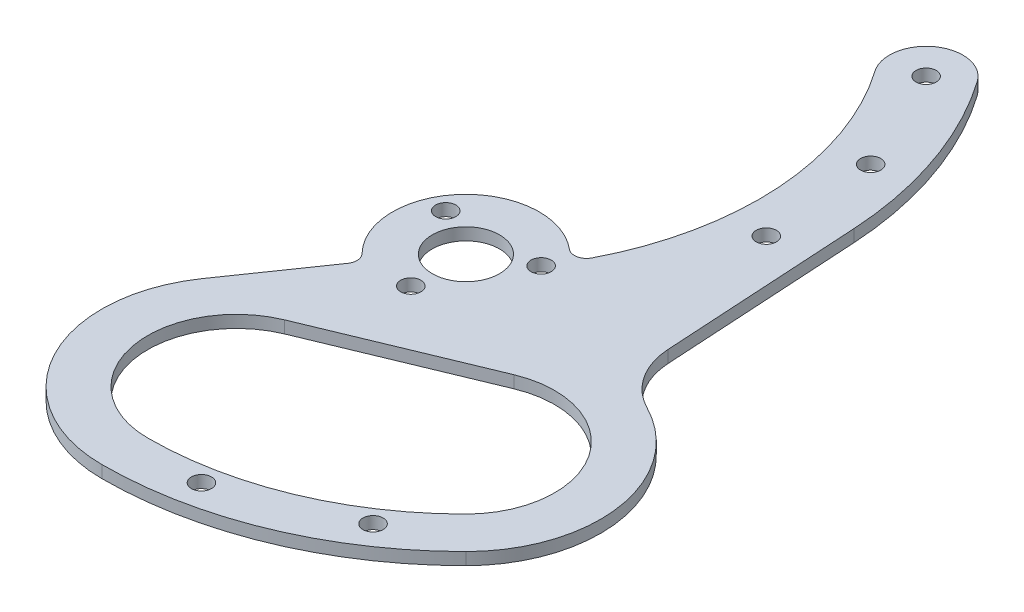
ISO-10303-21;
HEADER;
FILE_DESCRIPTION(('STEP AP214'),'2;1');
FILE_NAME('part.step','',(''),(''),'','','');
FILE_SCHEMA(('AUTOMOTIVE_DESIGN { 1 0 10303 214 1 1 1 1 }'));
ENDSEC;
DATA;
#1=APPLICATION_CONTEXT('core data for automotive mechanical design processes');
#2=APPLICATION_PROTOCOL_DEFINITION('international standard','automotive_design',2000,#1);
#3=PRODUCT_CONTEXT('',#1,'mechanical');
#4=PRODUCT('Part','Part','',(#3));
#5=PRODUCT_RELATED_PRODUCT_CATEGORY('part','',(#4));
#6=PRODUCT_DEFINITION_FORMATION('','',#4);
#7=PRODUCT_DEFINITION_CONTEXT('part definition',#1,'design');
#8=PRODUCT_DEFINITION('design','',#6,#7);
#9=PRODUCT_DEFINITION_SHAPE('','',#8);
#10=(LENGTH_UNIT() NAMED_UNIT(*) SI_UNIT(.MILLI.,.METRE.));
#11=(NAMED_UNIT(*) PLANE_ANGLE_UNIT() SI_UNIT($,.RADIAN.));
#12=(NAMED_UNIT(*) SI_UNIT($,.STERADIAN.) SOLID_ANGLE_UNIT());
#13=UNCERTAINTY_MEASURE_WITH_UNIT(LENGTH_MEASURE(1.E-05),#10,'distance_accuracy_value','');
#14=(GEOMETRIC_REPRESENTATION_CONTEXT(3) GLOBAL_UNCERTAINTY_ASSIGNED_CONTEXT((#13)) GLOBAL_UNIT_ASSIGNED_CONTEXT((#10,
#11,#12)) REPRESENTATION_CONTEXT('',''));
#15=CARTESIAN_POINT('',(0.,0.,0.));
#16=DIRECTION('',(0.,0.,1.));
#17=DIRECTION('',(1.,0.,0.));
#18=AXIS2_PLACEMENT_3D('',#15,#16,#17);
#19=CARTESIAN_POINT('',(12.4144052382109,2.,-62.7929327163513));
#20=DIRECTION('',(0.,-1.,0.));
#21=DIRECTION('',(0.,0.,-1.));
#22=AXIS2_PLACEMENT_3D('',#19,#20,#21);
#23=PLANE('',#22);
#24=CARTESIAN_POINT('',(12.4144052382108,2.,-62.7929327163513));
#25=DIRECTION('',(0.,-1.,0.));
#26=DIRECTION('',(0.,0.,-1.));
#27=AXIS2_PLACEMENT_3D('',#24,#25,#26);
#28=CIRCLE('',#27,1.65000000000008);
#29=CARTESIAN_POINT('',(12.4144052382108,2.,-64.4429327163514));
#30=VERTEX_POINT('',#29);
#31=EDGE_CURVE('E481',#30,#30,#28,.T.);
#32=ORIENTED_EDGE('',*,*,#31,.T.);
#33=EDGE_LOOP('',(#32));
#34=FACE_BOUND('',#33,.T.);
#35=CARTESIAN_POINT('',(20.340189466215,2.,-45.7960335889309));
#36=DIRECTION('',(0.,-1.,0.));
#37=DIRECTION('',(0.,0.,-1.));
#38=AXIS2_PLACEMENT_3D('',#35,#36,#37);
#39=CIRCLE('',#38,1.64999999999996);
#40=CARTESIAN_POINT('',(20.340189466215,2.,-47.4460335889308));
#41=VERTEX_POINT('',#40);
#42=EDGE_CURVE('E486',#41,#41,#39,.T.);
#43=ORIENTED_EDGE('',*,*,#42,.T.);
#44=EDGE_LOOP('',(#43));
#45=FACE_BOUND('',#44,.T.);
#46=CARTESIAN_POINT('',(21.9747085435597,2.,-27.1133950450212));
#47=DIRECTION('',(0.,-1.,0.));
#48=DIRECTION('',(0.,0.,-1.));
#49=AXIS2_PLACEMENT_3D('',#46,#47,#48);
#50=CIRCLE('',#49,1.65);
#51=CARTESIAN_POINT('',(21.9747085435597,2.,-28.7633950450212));
#52=VERTEX_POINT('',#51);
#53=EDGE_CURVE('E441',#52,#52,#50,.T.);
#54=ORIENTED_EDGE('',*,*,#53,.T.);
#55=EDGE_LOOP('',(#54));
#56=FACE_BOUND('',#55,.T.);
#57=CARTESIAN_POINT('',(30.5548779494707,2.,45.7286064167185));
#58=DIRECTION('',(0.,1.,0.));
#59=DIRECTION('',(0.,0.,-1.));
#60=AXIS2_PLACEMENT_3D('',#57,#58,#59);
#61=CIRCLE('',#60,1.65);
#62=CARTESIAN_POINT('',(30.5548779494707,2.,44.0786064167185));
#63=VERTEX_POINT('',#62);
#64=EDGE_CURVE('E192',#63,#63,#61,.T.);
#65=ORIENTED_EDGE('',*,*,#64,.F.);
#66=EDGE_LOOP('',(#65));
#67=FACE_BOUND('',#66,.T.);
#68=CARTESIAN_POINT('',(10.7294462950743,2.,53.9405690878703));
#69=DIRECTION('',(0.,1.,0.));
#70=DIRECTION('',(0.,0.,1.));
#71=AXIS2_PLACEMENT_3D('',#68,#69,#70);
#72=CIRCLE('',#71,1.65);
#73=CARTESIAN_POINT('',(10.7294462950743,2.,55.5905690878703));
#74=VERTEX_POINT('',#73);
#75=EDGE_CURVE('E198',#74,#74,#72,.T.);
#76=ORIENTED_EDGE('',*,*,#75,.F.);
#77=EDGE_LOOP('',(#76));
#78=FACE_BOUND('',#77,.T.);
#79=CARTESIAN_POINT('',(12.4144052382109,2.,-62.7929327163513));
#80=DIRECTION('',(0.,1.,0.));
#81=DIRECTION('',(0.,0.,-1.));
#82=AXIS2_PLACEMENT_3D('',#79,#80,#81);
#83=CIRCLE('',#82,6.);
#84=CARTESIAN_POINT('',(17.3293175039448,2.,-66.2343913344576));
#85=VERTEX_POINT('',#84);
#86=CARTESIAN_POINT('',(7.49949297247695,2.,-59.351474098245));
#87=VERTEX_POINT('',#86);
#88=EDGE_CURVE('E204',#85,#87,#83,.T.);
#89=ORIENTED_EDGE('',*,*,#88,.T.);
#90=CARTESIAN_POINT('',(-31.8198051533946,2.,-31.8198051533947));
#91=DIRECTION('',(0.,-1.,0.));
#92=DIRECTION('',(0.,0.,-1.));
#93=AXIS2_PLACEMENT_3D('',#90,#91,#92);
#94=CIRCLE('',#93,48.);
#95=CARTESIAN_POINT('',(10.8166216797478,2.,-9.77133339451546));
#96=VERTEX_POINT('',#95);
#97=EDGE_CURVE('E207',#87,#96,#94,.T.);
#98=ORIENTED_EDGE('',*,*,#97,.T.);
#99=CARTESIAN_POINT('',(9.04010389503357,2.,-10.6900197178021));
#100=DIRECTION('',(0.,-1.,0.));
#101=DIRECTION('',(0.,0.,-1.));
#102=AXIS2_PLACEMENT_3D('',#99,#100,#101);
#103=CIRCLE('',#102,2.);
#104=CARTESIAN_POINT('',(7.74866048145734,2.,-9.16287404383036));
#105=VERTEX_POINT('',#104);
#106=EDGE_CURVE('E279',#96,#105,#103,.T.);
#107=ORIENTED_EDGE('',*,*,#106,.T.);
#108=CARTESIAN_POINT('',(0.,2.,0.));
#109=DIRECTION('',(0.,1.,0.));
#110=DIRECTION('',(0.,0.,1.));
#111=AXIS2_PLACEMENT_3D('',#108,#109,#110);
#112=CIRCLE('',#111,12.);
#113=CARTESIAN_POINT('',(-8.57705807279926,2.,8.39250110609631));
#114=VERTEX_POINT('',#113);
#115=EDGE_CURVE('E211',#105,#114,#112,.T.);
#116=ORIENTED_EDGE('',*,*,#115,.T.);
#117=CARTESIAN_POINT('',(-10.0065677515991,2.,9.7912512904457));
#118=DIRECTION('',(0.,-1.,0.));
#119=DIRECTION('',(0.,0.,-1.));
#120=AXIS2_PLACEMENT_3D('',#117,#118,#119);
#121=CIRCLE('',#120,2.);
#122=CARTESIAN_POINT('',(-8.36222213886381,2.,10.9297272479775));
#123=VERTEX_POINT('',#122);
#124=EDGE_CURVE('E275',#114,#123,#121,.T.);
#125=ORIENTED_EDGE('',*,*,#124,.T.);
#126=DIRECTION('',(-0.569237978765922,0.,0.822172806367669));
#127=VECTOR('',#126,1.);
#128=CARTESIAN_POINT('',(-7.35806894846151,2.,9.47938929202116));
#129=LINE('',#128,#127);
#130=CARTESIAN_POINT('',(-18.0878017400887,2.,24.9767644671498));
#131=VERTEX_POINT('',#130);
#132=EDGE_CURVE('E214',#123,#131,#129,.T.);
#133=ORIENTED_EDGE('',*,*,#132,.T.);
#134=CARTESIAN_POINT('',(0.,2.,37.5));
#135=DIRECTION('',(0.,1.,0.));
#136=DIRECTION('',(0.,0.,-1.));
#137=AXIS2_PLACEMENT_3D('',#134,#135,#136);
#138=CIRCLE('',#137,22.);
#139=CARTESIAN_POINT('',(0.,2.,59.5));
#140=VERTEX_POINT('',#139);
#141=EDGE_CURVE('E216',#131,#140,#138,.T.);
#142=ORIENTED_EDGE('',*,*,#141,.T.);
#143=CARTESIAN_POINT('',(0.,2.,0.));
#144=DIRECTION('',(0.,1.,0.));
#145=DIRECTION('',(0.,0.,-1.));
#146=AXIS2_PLACEMENT_3D('',#143,#144,#145);
#147=CIRCLE('',#146,59.5);
#148=CARTESIAN_POINT('',(42.0728534805996,2.,42.0728534805995));
#149=VERTEX_POINT('',#148);
#150=EDGE_CURVE('E218',#140,#149,#147,.T.);
#151=ORIENTED_EDGE('',*,*,#150,.T.);
#152=CARTESIAN_POINT('',(26.5165042944956,2.,26.5165042944955));
#153=DIRECTION('',(0.,1.,0.));
#154=DIRECTION('',(0.,0.,1.));
#155=AXIS2_PLACEMENT_3D('',#152,#153,#154);
#156=CIRCLE('',#155,22.);
#157=CARTESIAN_POINT('',(36.5104743417037,2.,6.91751037400286));
#158=VERTEX_POINT('',#157);
#159=EDGE_CURVE('E220',#149,#158,#156,.T.);
#160=ORIENTED_EDGE('',*,*,#159,.T.);
#161=CARTESIAN_POINT('',(41.9617307310899,2.,-3.77284994626585));
#162=DIRECTION('',(0.,-1.,0.));
#163=DIRECTION('',(0.,0.,-1.));
#164=AXIS2_PLACEMENT_3D('',#161,#162,#163);
#165=CIRCLE('',#164,12.);
#166=CARTESIAN_POINT('',(29.9825963673094,2.,-3.0655028642094));
#167=VERTEX_POINT('',#166);
#168=EDGE_CURVE('E11',#158,#167,#165,.T.);
#169=ORIENTED_EDGE('',*,*,#168,.T.);
#170=DIRECTION('',(-0.0589455901713703,0.,-0.998261196981706));
#171=VECTOR('',#170,1.);
#172=CARTESIAN_POINT('',(30.4512467939954,2.,4.87123225964618));
#173=LINE('',#172,#171);
#174=CARTESIAN_POINT('',(28.0758666655078,2.,-35.3565405636769));
#175=VERTEX_POINT('',#174);
#176=EDGE_CURVE('E222',#167,#175,#173,.T.);
#177=ORIENTED_EDGE('',*,*,#176,.T.);
#178=CARTESIAN_POINT('',(-31.8198051533946,2.,-31.8198051533947));
#179=DIRECTION('',(0.,1.,0.));
#180=DIRECTION('',(0.,0.,-1.));
#181=AXIS2_PLACEMENT_3D('',#178,#179,#180);
#182=CIRCLE('',#181,60.);
#183=EDGE_CURVE('E224',#175,#85,#182,.T.);
#184=ORIENTED_EDGE('',*,*,#183,.T.);
#185=EDGE_LOOP('',(#89,#98,#107,#116,#125,#133,#142,#151,#160,#169,#177,#184));
#186=FACE_BOUND('',#185,.T.);
#187=CARTESIAN_POINT('',(0.,2.,37.5));
#188=DIRECTION('',(0.,1.,0.));
#189=DIRECTION('',(0.,0.,-1.));
#190=AXIS2_PLACEMENT_3D('',#187,#188,#189);
#191=CIRCLE('',#190,14.5);
#192=CARTESIAN_POINT('',(-5.54890976929381,2.,24.1037467785863));
#193=VERTEX_POINT('',#192);
#194=CARTESIAN_POINT('',(0.,2.,52.));
#195=VERTEX_POINT('',#194);
#196=EDGE_CURVE('E148',#193,#195,#191,.T.);
#197=ORIENTED_EDGE('',*,*,#196,.F.);
#198=DIRECTION('',(-0.923879532511287,0.,0.38268343236509));
#199=VECTOR('',#198,1.);
#200=CARTESIAN_POINT('',(-5.54890976929381,2.,24.1037467785863));
#201=LINE('',#200,#199);
#202=CARTESIAN_POINT('',(20.9675945252018,2.,13.1202510730819));
#203=VERTEX_POINT('',#202);
#204=EDGE_CURVE('E174',#203,#193,#201,.T.);
#205=ORIENTED_EDGE('',*,*,#204,.F.);
#206=CARTESIAN_POINT('',(26.5165042944956,2.,26.5165042944955));
#207=DIRECTION('',(0.,1.,0.));
#208=DIRECTION('',(0.,0.,1.));
#209=AXIS2_PLACEMENT_3D('',#206,#207,#208);
#210=CIRCLE('',#209,14.5);
#211=CARTESIAN_POINT('',(36.7695526217005,2.,36.7695526217004));
#212=VERTEX_POINT('',#211);
#213=EDGE_CURVE('E172',#212,#203,#210,.T.);
#214=ORIENTED_EDGE('',*,*,#213,.F.);
#215=CARTESIAN_POINT('',(0.,2.,0.));
#216=DIRECTION('',(0.,1.,0.));
#217=DIRECTION('',(0.,0.,1.));
#218=AXIS2_PLACEMENT_3D('',#215,#216,#217);
#219=CIRCLE('',#218,52.);
#220=EDGE_CURVE('E158',#195,#212,#219,.T.);
#221=ORIENTED_EDGE('',*,*,#220,.F.);
#222=EDGE_LOOP('',(#197,#205,#214,#221));
#223=FACE_BOUND('',#222,.T.);
#224=CARTESIAN_POINT('',(0.,2.,0.));
#225=DIRECTION('',(0.,1.,0.));
#226=DIRECTION('',(0.,0.,1.));
#227=AXIS2_PLACEMENT_3D('',#224,#225,#226);
#228=CIRCLE('',#227,5.5);
#229=CARTESIAN_POINT('',(0.,2.,5.5));
#230=VERTEX_POINT('',#229);
#231=EDGE_CURVE('E181',#230,#230,#228,.T.);
#232=ORIENTED_EDGE('',*,*,#231,.F.);
#233=EDGE_LOOP('',(#232));
#234=FACE_BOUND('',#233,.T.);
#235=CARTESIAN_POINT('',(0.,2.,9.));
#236=DIRECTION('',(0.,1.,0.));
#237=DIRECTION('',(0.,0.,1.));
#238=AXIS2_PLACEMENT_3D('',#235,#236,#237);
#239=CIRCLE('',#238,1.65);
#240=CARTESIAN_POINT('',(0.,2.,10.65));
#241=VERTEX_POINT('',#240);
#242=EDGE_CURVE('E456',#241,#241,#239,.T.);
#243=ORIENTED_EDGE('',*,*,#242,.F.);
#244=EDGE_LOOP('',(#243));
#245=FACE_BOUND('',#244,.T.);
#246=CARTESIAN_POINT('',(-7.79422863405996,2.,-4.49999999999998));
#247=DIRECTION('',(0.,1.,0.));
#248=DIRECTION('',(0.,0.,1.));
#249=AXIS2_PLACEMENT_3D('',#246,#247,#248);
#250=CIRCLE('',#249,1.65);
#251=CARTESIAN_POINT('',(-7.79422863405996,2.,-2.84999999999998));
#252=VERTEX_POINT('',#251);
#253=EDGE_CURVE('E451',#252,#252,#250,.T.);
#254=ORIENTED_EDGE('',*,*,#253,.F.);
#255=EDGE_LOOP('',(#254));
#256=FACE_BOUND('',#255,.T.);
#257=CARTESIAN_POINT('',(7.79422863405996,2.,-4.49999999999998));
#258=DIRECTION('',(0.,1.,0.));
#259=DIRECTION('',(0.,0.,1.));
#260=AXIS2_PLACEMENT_3D('',#257,#258,#259);
#261=CIRCLE('',#260,1.65);
#262=CARTESIAN_POINT('',(7.79422863405996,2.,-2.84999999999999));
#263=VERTEX_POINT('',#262);
#264=EDGE_CURVE('E440',#263,#263,#261,.T.);
#265=ORIENTED_EDGE('',*,*,#264,.F.);
#266=EDGE_LOOP('',(#265));
#267=FACE_BOUND('',#266,.T.);
#268=ADVANCED_FACE('F34',(#34,#45,#56,#67,#78,#186,#223,#234,#245,#256,#267),#23,.F.);
#269=CARTESIAN_POINT('',(12.4144052382109,0.,-62.7929327163513));
#270=DIRECTION('',(0.,-1.,0.));
#271=DIRECTION('',(0.,0.,-1.));
#272=AXIS2_PLACEMENT_3D('',#269,#270,#271);
#273=PLANE('',#272);
#274=CARTESIAN_POINT('',(12.4144052382108,0.,-62.7929327163513));
#275=DIRECTION('',(0.,-1.,0.));
#276=DIRECTION('',(0.,0.,-1.));
#277=AXIS2_PLACEMENT_3D('',#274,#275,#276);
#278=CIRCLE('',#277,1.65000000000008);
#279=CARTESIAN_POINT('',(12.4144052382108,0.,-64.4429327163514));
#280=VERTEX_POINT('',#279);
#281=EDGE_CURVE('E489',#280,#280,#278,.T.);
#282=ORIENTED_EDGE('',*,*,#281,.F.);
#283=EDGE_LOOP('',(#282));
#284=FACE_BOUND('',#283,.T.);
#285=CARTESIAN_POINT('',(20.340189466215,0.,-45.7960335889309));
#286=DIRECTION('',(0.,-1.,0.));
#287=DIRECTION('',(0.,0.,-1.));
#288=AXIS2_PLACEMENT_3D('',#285,#286,#287);
#289=CIRCLE('',#288,1.64999999999996);
#290=CARTESIAN_POINT('',(20.340189466215,0.,-47.4460335889308));
#291=VERTEX_POINT('',#290);
#292=EDGE_CURVE('E483',#291,#291,#289,.T.);
#293=ORIENTED_EDGE('',*,*,#292,.F.);
#294=EDGE_LOOP('',(#293));
#295=FACE_BOUND('',#294,.T.);
#296=CARTESIAN_POINT('',(21.9747085435597,0.,-27.1133950450212));
#297=DIRECTION('',(0.,-1.,0.));
#298=DIRECTION('',(0.,0.,-1.));
#299=AXIS2_PLACEMENT_3D('',#296,#297,#298);
#300=CIRCLE('',#299,1.65);
#301=CARTESIAN_POINT('',(21.9747085435597,0.,-28.7633950450212));
#302=VERTEX_POINT('',#301);
#303=EDGE_CURVE('E447',#302,#302,#300,.T.);
#304=ORIENTED_EDGE('',*,*,#303,.F.);
#305=EDGE_LOOP('',(#304));
#306=FACE_BOUND('',#305,.T.);
#307=CARTESIAN_POINT('',(-7.79422863405996,0.,-4.49999999999998));
#308=DIRECTION('',(0.,1.,0.));
#309=DIRECTION('',(0.,0.,1.));
#310=AXIS2_PLACEMENT_3D('',#307,#308,#309);
#311=CIRCLE('',#310,1.65);
#312=CARTESIAN_POINT('',(-7.79422863405996,0.,-2.84999999999998));
#313=VERTEX_POINT('',#312);
#314=EDGE_CURVE('E444',#313,#313,#311,.T.);
#315=ORIENTED_EDGE('',*,*,#314,.T.);
#316=EDGE_LOOP('',(#315));
#317=FACE_BOUND('',#316,.T.);
#318=CARTESIAN_POINT('',(0.,0.,0.));
#319=DIRECTION('',(0.,1.,0.));
#320=DIRECTION('',(0.,0.,1.));
#321=AXIS2_PLACEMENT_3D('',#318,#319,#320);
#322=CIRCLE('',#321,5.5);
#323=CARTESIAN_POINT('',(0.,0.,5.5));
#324=VERTEX_POINT('',#323);
#325=EDGE_CURVE('E459',#324,#324,#322,.T.);
#326=ORIENTED_EDGE('',*,*,#325,.T.);
#327=EDGE_LOOP('',(#326));
#328=FACE_BOUND('',#327,.T.);
#329=CARTESIAN_POINT('',(10.7294462950743,0.,53.9405690878703));
#330=DIRECTION('',(0.,1.,0.));
#331=DIRECTION('',(0.,0.,1.));
#332=AXIS2_PLACEMENT_3D('',#329,#330,#331);
#333=CIRCLE('',#332,1.65);
#334=CARTESIAN_POINT('',(10.7294462950743,0.,55.5905690878703));
#335=VERTEX_POINT('',#334);
#336=EDGE_CURVE('E195',#335,#335,#333,.T.);
#337=ORIENTED_EDGE('',*,*,#336,.T.);
#338=EDGE_LOOP('',(#337));
#339=FACE_BOUND('',#338,.T.);
#340=CARTESIAN_POINT('',(12.4144052382109,0.,-62.7929327163513));
#341=DIRECTION('',(0.,1.,0.));
#342=DIRECTION('',(0.,0.,-1.));
#343=AXIS2_PLACEMENT_3D('',#340,#341,#342);
#344=CIRCLE('',#343,6.);
#345=CARTESIAN_POINT('',(17.3293175039448,0.,-66.2343913344576));
#346=VERTEX_POINT('',#345);
#347=CARTESIAN_POINT('',(7.49949297247695,0.,-59.351474098245));
#348=VERTEX_POINT('',#347);
#349=EDGE_CURVE('E201',#346,#348,#344,.T.);
#350=ORIENTED_EDGE('',*,*,#349,.F.);
#351=CARTESIAN_POINT('',(-31.8198051533946,0.,-31.8198051533947));
#352=DIRECTION('',(0.,1.,0.));
#353=DIRECTION('',(0.,0.,-1.));
#354=AXIS2_PLACEMENT_3D('',#351,#352,#353);
#355=CIRCLE('',#354,60.);
#356=CARTESIAN_POINT('',(28.0758666655078,0.,-35.3565405636769));
#357=VERTEX_POINT('',#356);
#358=EDGE_CURVE('E208',#357,#346,#355,.T.);
#359=ORIENTED_EDGE('',*,*,#358,.F.);
#360=DIRECTION('',(-0.0589455901713703,0.,-0.998261196981706));
#361=VECTOR('',#360,1.);
#362=CARTESIAN_POINT('',(30.4512467939954,0.,4.87123225964618));
#363=LINE('',#362,#361);
#364=CARTESIAN_POINT('',(29.9825963673094,0.,-3.0655028642094));
#365=VERTEX_POINT('',#364);
#366=EDGE_CURVE('E243',#365,#357,#363,.T.);
#367=ORIENTED_EDGE('',*,*,#366,.F.);
#368=CARTESIAN_POINT('',(41.9617307310899,0.,-3.77284994626585));
#369=DIRECTION('',(0.,-1.,0.));
#370=DIRECTION('',(0.,0.,-1.));
#371=AXIS2_PLACEMENT_3D('',#368,#369,#370);
#372=CIRCLE('',#371,12.);
#373=CARTESIAN_POINT('',(36.5104743417037,0.,6.91751037400286));
#374=VERTEX_POINT('',#373);
#375=EDGE_CURVE('E42',#365,#374,#372,.F.);
#376=ORIENTED_EDGE('',*,*,#375,.T.);
#377=CARTESIAN_POINT('',(26.5165042944956,0.,26.5165042944955));
#378=DIRECTION('',(0.,1.,0.));
#379=DIRECTION('',(0.,0.,1.));
#380=AXIS2_PLACEMENT_3D('',#377,#378,#379);
#381=CIRCLE('',#380,22.);
#382=CARTESIAN_POINT('',(42.0728534805996,0.,42.0728534805995));
#383=VERTEX_POINT('',#382);
#384=EDGE_CURVE('E241',#383,#374,#381,.T.);
#385=ORIENTED_EDGE('',*,*,#384,.F.);
#386=CARTESIAN_POINT('',(0.,0.,0.));
#387=DIRECTION('',(0.,1.,0.));
#388=DIRECTION('',(0.,0.,-1.));
#389=AXIS2_PLACEMENT_3D('',#386,#387,#388);
#390=CIRCLE('',#389,59.5);
#391=CARTESIAN_POINT('',(0.,0.,59.5));
#392=VERTEX_POINT('',#391);
#393=EDGE_CURVE('E239',#392,#383,#390,.T.);
#394=ORIENTED_EDGE('',*,*,#393,.F.);
#395=CARTESIAN_POINT('',(0.,0.,37.5));
#396=DIRECTION('',(0.,1.,0.));
#397=DIRECTION('',(0.,0.,-1.));
#398=AXIS2_PLACEMENT_3D('',#395,#396,#397);
#399=CIRCLE('',#398,22.);
#400=CARTESIAN_POINT('',(-18.0878017400887,0.,24.9767644671498));
#401=VERTEX_POINT('',#400);
#402=EDGE_CURVE('E237',#401,#392,#399,.T.);
#403=ORIENTED_EDGE('',*,*,#402,.F.);
#404=DIRECTION('',(-0.569237978765922,0.,0.822172806367669));
#405=VECTOR('',#404,1.);
#406=CARTESIAN_POINT('',(-7.35806894846151,0.,9.47938929202116));
#407=LINE('',#406,#405);
#408=CARTESIAN_POINT('',(-8.36222213886381,0.,10.9297272479775));
#409=VERTEX_POINT('',#408);
#410=EDGE_CURVE('E235',#409,#401,#407,.T.);
#411=ORIENTED_EDGE('',*,*,#410,.F.);
#412=CARTESIAN_POINT('',(-10.0065677515991,0.,9.7912512904457));
#413=DIRECTION('',(0.,-1.,0.));
#414=DIRECTION('',(0.,0.,-1.));
#415=AXIS2_PLACEMENT_3D('',#412,#413,#414);
#416=CIRCLE('',#415,2.);
#417=CARTESIAN_POINT('',(-8.57705807279926,0.,8.39250110609631));
#418=VERTEX_POINT('',#417);
#419=EDGE_CURVE('E273',#409,#418,#416,.F.);
#420=ORIENTED_EDGE('',*,*,#419,.T.);
#421=CARTESIAN_POINT('',(0.,0.,0.));
#422=DIRECTION('',(0.,1.,0.));
#423=DIRECTION('',(0.,0.,1.));
#424=AXIS2_PLACEMENT_3D('',#421,#422,#423);
#425=CIRCLE('',#424,12.);
#426=CARTESIAN_POINT('',(7.74866048145734,0.,-9.16287404383036));
#427=VERTEX_POINT('',#426);
#428=EDGE_CURVE('E232',#427,#418,#425,.T.);
#429=ORIENTED_EDGE('',*,*,#428,.F.);
#430=CARTESIAN_POINT('',(9.04010389503357,0.,-10.6900197178021));
#431=DIRECTION('',(0.,-1.,0.));
#432=DIRECTION('',(0.,0.,-1.));
#433=AXIS2_PLACEMENT_3D('',#430,#431,#432);
#434=CIRCLE('',#433,2.);
#435=CARTESIAN_POINT('',(10.8166216797478,0.,-9.77133339451546));
#436=VERTEX_POINT('',#435);
#437=EDGE_CURVE('E277',#427,#436,#434,.F.);
#438=ORIENTED_EDGE('',*,*,#437,.T.);
#439=CARTESIAN_POINT('',(-31.8198051533946,0.,-31.8198051533947));
#440=DIRECTION('',(0.,-1.,0.));
#441=DIRECTION('',(0.,0.,-1.));
#442=AXIS2_PLACEMENT_3D('',#439,#440,#441);
#443=CIRCLE('',#442,48.);
#444=EDGE_CURVE('E229',#348,#436,#443,.T.);
#445=ORIENTED_EDGE('',*,*,#444,.F.);
#446=EDGE_LOOP('',(#350,#359,#367,#376,#385,#394,#403,#411,#420,#429,#438,#445));
#447=FACE_BOUND('',#446,.T.);
#448=CARTESIAN_POINT('',(30.5548779494707,0.,45.7286064167185));
#449=DIRECTION('',(0.,1.,0.));
#450=DIRECTION('',(0.,0.,-1.));
#451=AXIS2_PLACEMENT_3D('',#448,#449,#450);
#452=CIRCLE('',#451,1.65);
#453=CARTESIAN_POINT('',(30.5548779494707,0.,44.0786064167185));
#454=VERTEX_POINT('',#453);
#455=EDGE_CURVE('E166',#454,#454,#452,.T.);
#456=ORIENTED_EDGE('',*,*,#455,.T.);
#457=EDGE_LOOP('',(#456));
#458=FACE_BOUND('',#457,.T.);
#459=DIRECTION('',(-0.923879532511287,0.,0.38268343236509));
#460=VECTOR('',#459,1.);
#461=CARTESIAN_POINT('',(-5.54890976929381,0.,24.1037467785863));
#462=LINE('',#461,#460);
#463=CARTESIAN_POINT('',(20.9675945252018,0.,13.1202510730818));
#464=VERTEX_POINT('',#463);
#465=CARTESIAN_POINT('',(-5.54890976929381,0.,24.1037467785864));
#466=VERTEX_POINT('',#465);
#467=EDGE_CURVE('E159',#464,#466,#462,.T.);
#468=ORIENTED_EDGE('',*,*,#467,.T.);
#469=CARTESIAN_POINT('',(0.,0.,37.5));
#470=DIRECTION('',(0.,1.,0.));
#471=DIRECTION('',(0.,0.,-1.));
#472=AXIS2_PLACEMENT_3D('',#469,#470,#471);
#473=CIRCLE('',#472,14.5);
#474=CARTESIAN_POINT('',(0.,0.,52.));
#475=VERTEX_POINT('',#474);
#476=EDGE_CURVE('E179',#466,#475,#473,.T.);
#477=ORIENTED_EDGE('',*,*,#476,.T.);
#478=CARTESIAN_POINT('',(0.,0.,0.));
#479=DIRECTION('',(0.,1.,0.));
#480=DIRECTION('',(0.,0.,1.));
#481=AXIS2_PLACEMENT_3D('',#478,#479,#480);
#482=CIRCLE('',#481,52.);
#483=CARTESIAN_POINT('',(36.7695526217005,0.,36.7695526217004));
#484=VERTEX_POINT('',#483);
#485=EDGE_CURVE('E165',#475,#484,#482,.T.);
#486=ORIENTED_EDGE('',*,*,#485,.T.);
#487=CARTESIAN_POINT('',(26.5165042944956,0.,26.5165042944955));
#488=DIRECTION('',(0.,1.,0.));
#489=DIRECTION('',(0.,0.,1.));
#490=AXIS2_PLACEMENT_3D('',#487,#488,#489);
#491=CIRCLE('',#490,14.5);
#492=EDGE_CURVE('E183',#484,#464,#491,.T.);
#493=ORIENTED_EDGE('',*,*,#492,.T.);
#494=EDGE_LOOP('',(#468,#477,#486,#493));
#495=FACE_BOUND('',#494,.T.);
#496=CARTESIAN_POINT('',(0.,0.,9.));
#497=DIRECTION('',(0.,1.,0.));
#498=DIRECTION('',(0.,0.,1.));
#499=AXIS2_PLACEMENT_3D('',#496,#497,#498);
#500=CIRCLE('',#499,1.65);
#501=CARTESIAN_POINT('',(0.,0.,10.65));
#502=VERTEX_POINT('',#501);
#503=EDGE_CURVE('E435',#502,#502,#500,.T.);
#504=ORIENTED_EDGE('',*,*,#503,.T.);
#505=EDGE_LOOP('',(#504));
#506=FACE_BOUND('',#505,.T.);
#507=CARTESIAN_POINT('',(7.79422863405996,0.,-4.49999999999998));
#508=DIRECTION('',(0.,1.,0.));
#509=DIRECTION('',(0.,0.,1.));
#510=AXIS2_PLACEMENT_3D('',#507,#508,#509);
#511=CIRCLE('',#510,1.65);
#512=CARTESIAN_POINT('',(7.79422863405996,0.,-2.84999999999999));
#513=VERTEX_POINT('',#512);
#514=EDGE_CURVE('E438',#513,#513,#511,.T.);
#515=ORIENTED_EDGE('',*,*,#514,.T.);
#516=EDGE_LOOP('',(#515));
#517=FACE_BOUND('',#516,.T.);
#518=ADVANCED_FACE('F293',(#284,#295,#306,#317,#328,#339,#447,#458,#495,#506,#517),#273,.T.);
#519=CARTESIAN_POINT('',(12.4144052382109,2.,-62.7929327163513));
#520=DIRECTION('',(0.,-1.,0.));
#521=DIRECTION('',(0.,0.,-1.));
#522=AXIS2_PLACEMENT_3D('',#519,#520,#521);
#523=CYLINDRICAL_SURFACE('',#522,6.);
#524=ORIENTED_EDGE('',*,*,#349,.T.);
#525=DIRECTION('',(0.,-1.,0.));
#526=VECTOR('',#525,1.);
#527=CARTESIAN_POINT('',(7.49949297247695,2.,-59.351474098245));
#528=LINE('',#527,#526);
#529=EDGE_CURVE('E260',#87,#348,#528,.T.);
#530=ORIENTED_EDGE('',*,*,#529,.F.);
#531=ORIENTED_EDGE('',*,*,#88,.F.);
#532=DIRECTION('',(0.,-1.,0.));
#533=VECTOR('',#532,1.);
#534=CARTESIAN_POINT('',(17.3293175039448,2.,-66.2343913344576));
#535=LINE('',#534,#533);
#536=EDGE_CURVE('E226',#85,#346,#535,.T.);
#537=ORIENTED_EDGE('',*,*,#536,.T.);
#538=EDGE_LOOP('',(#524,#530,#531,#537));
#539=FACE_BOUND('',#538,.T.);
#540=ADVANCED_FACE('F301',(#539),#523,.T.);
#541=CARTESIAN_POINT('',(-31.8198051533946,2.,-31.8198051533947));
#542=DIRECTION('',(0.,-1.,0.));
#543=DIRECTION('',(0.,0.,-1.));
#544=AXIS2_PLACEMENT_3D('',#541,#542,#543);
#545=CYLINDRICAL_SURFACE('',#544,48.);
#546=ORIENTED_EDGE('',*,*,#444,.T.);
#547=DIRECTION('',(0.,-1.,0.));
#548=VECTOR('',#547,1.);
#549=CARTESIAN_POINT('',(10.8166216797478,2.,-9.77133339451546));
#550=LINE('',#549,#548);
#551=EDGE_CURVE('E271',#436,#96,#550,.F.);
#552=ORIENTED_EDGE('',*,*,#551,.T.);
#553=ORIENTED_EDGE('',*,*,#97,.F.);
#554=ORIENTED_EDGE('',*,*,#529,.T.);
#555=EDGE_LOOP('',(#546,#552,#553,#554));
#556=FACE_BOUND('',#555,.T.);
#557=ADVANCED_FACE('F348',(#556),#545,.F.);
#558=CARTESIAN_POINT('',(0.,2.,0.));
#559=DIRECTION('',(0.,-1.,0.));
#560=DIRECTION('',(0.,0.,-1.));
#561=AXIS2_PLACEMENT_3D('',#558,#559,#560);
#562=CYLINDRICAL_SURFACE('',#561,12.);
#563=ORIENTED_EDGE('',*,*,#428,.T.);
#564=DIRECTION('',(0.,-1.,0.));
#565=VECTOR('',#564,1.);
#566=CARTESIAN_POINT('',(-8.57705807279926,2.,8.39250110609631));
#567=LINE('',#566,#565);
#568=EDGE_CURVE('E269',#418,#114,#567,.F.);
#569=ORIENTED_EDGE('',*,*,#568,.T.);
#570=ORIENTED_EDGE('',*,*,#115,.F.);
#571=DIRECTION('',(0.,-1.,0.));
#572=VECTOR('',#571,1.);
#573=CARTESIAN_POINT('',(7.74866048145734,2.,-9.16287404383036));
#574=LINE('',#573,#572);
#575=EDGE_CURVE('E266',#105,#427,#574,.T.);
#576=ORIENTED_EDGE('',*,*,#575,.T.);
#577=EDGE_LOOP('',(#563,#569,#570,#576));
#578=FACE_BOUND('',#577,.T.);
#579=ADVANCED_FACE('F344',(#578),#562,.T.);
#580=CARTESIAN_POINT('',(-7.35806894846151,2.,9.47938929202116));
#581=DIRECTION('',(0.822172806367669,0.,0.569237978765922));
#582=DIRECTION('',(0.569237978765922,0.,-0.822172806367669));
#583=AXIS2_PLACEMENT_3D('',#580,#581,#582);
#584=PLANE('',#583);
#585=ORIENTED_EDGE('',*,*,#132,.F.);
#586=DIRECTION('',(0.,1.,0.));
#587=VECTOR('',#586,1.);
#588=CARTESIAN_POINT('',(-8.36222213886381,0.,10.9297272479775));
#589=LINE('',#588,#587);
#590=EDGE_CURVE('E263',#123,#409,#589,.F.);
#591=ORIENTED_EDGE('',*,*,#590,.T.);
#592=ORIENTED_EDGE('',*,*,#410,.T.);
#593=DIRECTION('',(0.,-1.,0.));
#594=VECTOR('',#593,1.);
#595=CARTESIAN_POINT('',(-18.0878017400887,2.,24.9767644671498));
#596=LINE('',#595,#594);
#597=EDGE_CURVE('E257',#131,#401,#596,.T.);
#598=ORIENTED_EDGE('',*,*,#597,.F.);
#599=EDGE_LOOP('',(#585,#591,#592,#598));
#600=FACE_BOUND('',#599,.T.);
#601=ADVANCED_FACE('F340',(#600),#584,.F.);
#602=CARTESIAN_POINT('',(0.,2.,37.5));
#603=DIRECTION('',(0.,-1.,0.));
#604=DIRECTION('',(0.,0.,-1.));
#605=AXIS2_PLACEMENT_3D('',#602,#603,#604);
#606=CYLINDRICAL_SURFACE('',#605,22.);
#607=ORIENTED_EDGE('',*,*,#402,.T.);
#608=DIRECTION('',(0.,-1.,0.));
#609=VECTOR('',#608,1.);
#610=CARTESIAN_POINT('',(0.,2.,59.5));
#611=LINE('',#610,#609);
#612=EDGE_CURVE('E254',#140,#392,#611,.T.);
#613=ORIENTED_EDGE('',*,*,#612,.F.);
#614=ORIENTED_EDGE('',*,*,#141,.F.);
#615=ORIENTED_EDGE('',*,*,#597,.T.);
#616=EDGE_LOOP('',(#607,#613,#614,#615));
#617=FACE_BOUND('',#616,.T.);
#618=ADVANCED_FACE('F336',(#617),#606,.T.);
#619=CARTESIAN_POINT('',(0.,2.,0.));
#620=DIRECTION('',(0.,-1.,0.));
#621=DIRECTION('',(0.,0.,-1.));
#622=AXIS2_PLACEMENT_3D('',#619,#620,#621);
#623=CYLINDRICAL_SURFACE('',#622,59.5);
#624=ORIENTED_EDGE('',*,*,#393,.T.);
#625=DIRECTION('',(0.,-1.,0.));
#626=VECTOR('',#625,1.);
#627=CARTESIAN_POINT('',(42.0728534805996,2.,42.0728534805995));
#628=LINE('',#627,#626);
#629=EDGE_CURVE('E251',#149,#383,#628,.T.);
#630=ORIENTED_EDGE('',*,*,#629,.F.);
#631=ORIENTED_EDGE('',*,*,#150,.F.);
#632=ORIENTED_EDGE('',*,*,#612,.T.);
#633=EDGE_LOOP('',(#624,#630,#631,#632));
#634=FACE_BOUND('',#633,.T.);
#635=ADVANCED_FACE('F333',(#634),#623,.T.);
#636=CARTESIAN_POINT('',(26.5165042944956,2.,26.5165042944955));
#637=DIRECTION('',(0.,-1.,0.));
#638=DIRECTION('',(0.,0.,-1.));
#639=AXIS2_PLACEMENT_3D('',#636,#637,#638);
#640=CYLINDRICAL_SURFACE('',#639,22.);
#641=ORIENTED_EDGE('',*,*,#384,.T.);
#642=DIRECTION('',(0.,-1.,0.));
#643=VECTOR('',#642,1.);
#644=CARTESIAN_POINT('',(36.5104743417037,2.,6.91751037400286));
#645=LINE('',#644,#643);
#646=EDGE_CURVE('E49',#374,#158,#645,.F.);
#647=ORIENTED_EDGE('',*,*,#646,.T.);
#648=ORIENTED_EDGE('',*,*,#159,.F.);
#649=ORIENTED_EDGE('',*,*,#629,.T.);
#650=EDGE_LOOP('',(#641,#647,#648,#649));
#651=FACE_BOUND('',#650,.T.);
#652=ADVANCED_FACE('F330',(#651),#640,.T.);
#653=CARTESIAN_POINT('',(30.4512467939954,2.,4.87123225964618));
#654=DIRECTION('',(-0.998261196981706,0.,0.0589455901713703));
#655=DIRECTION('',(0.0589455901713703,0.,0.998261196981706));
#656=AXIS2_PLACEMENT_3D('',#653,#654,#655);
#657=PLANE('',#656);
#658=ORIENTED_EDGE('',*,*,#176,.F.);
#659=DIRECTION('',(0.,1.,0.));
#660=VECTOR('',#659,1.);
#661=CARTESIAN_POINT('',(29.9825963673094,0.,-3.0655028642094));
#662=LINE('',#661,#660);
#663=EDGE_CURVE('E281',#167,#365,#662,.F.);
#664=ORIENTED_EDGE('',*,*,#663,.T.);
#665=ORIENTED_EDGE('',*,*,#366,.T.);
#666=DIRECTION('',(0.,-1.,0.));
#667=VECTOR('',#666,1.);
#668=CARTESIAN_POINT('',(28.0758666655078,2.,-35.3565405636769));
#669=LINE('',#668,#667);
#670=EDGE_CURVE('E248',#175,#357,#669,.T.);
#671=ORIENTED_EDGE('',*,*,#670,.F.);
#672=EDGE_LOOP('',(#658,#664,#665,#671));
#673=FACE_BOUND('',#672,.T.);
#674=ADVANCED_FACE('F287',(#673),#657,.F.);
#675=CARTESIAN_POINT('',(-31.8198051533946,2.,-31.8198051533947));
#676=DIRECTION('',(0.,-1.,0.));
#677=DIRECTION('',(0.,0.,-1.));
#678=AXIS2_PLACEMENT_3D('',#675,#676,#677);
#679=CYLINDRICAL_SURFACE('',#678,60.);
#680=ORIENTED_EDGE('',*,*,#358,.T.);
#681=ORIENTED_EDGE('',*,*,#536,.F.);
#682=ORIENTED_EDGE('',*,*,#183,.F.);
#683=ORIENTED_EDGE('',*,*,#670,.T.);
#684=EDGE_LOOP('',(#680,#681,#682,#683));
#685=FACE_BOUND('',#684,.T.);
#686=ADVANCED_FACE('F297',(#685),#679,.T.);
#687=CARTESIAN_POINT('',(10.7294462950743,2.,53.9405690878703));
#688=DIRECTION('',(0.,-1.,0.));
#689=DIRECTION('',(0.,0.,-1.));
#690=AXIS2_PLACEMENT_3D('',#687,#688,#689);
#691=CYLINDRICAL_SURFACE('',#690,1.65);
#692=ORIENTED_EDGE('',*,*,#75,.T.);
#693=EDGE_LOOP('',(#692));
#694=FACE_BOUND('',#693,.T.);
#695=ORIENTED_EDGE('',*,*,#336,.F.);
#696=EDGE_LOOP('',(#695));
#697=FACE_BOUND('',#696,.T.);
#698=ADVANCED_FACE('F323',(#694,#697),#691,.F.);
#699=CARTESIAN_POINT('',(30.5548779494707,2.,45.7286064167185));
#700=DIRECTION('',(0.,-1.,0.));
#701=DIRECTION('',(0.,0.,-1.));
#702=AXIS2_PLACEMENT_3D('',#699,#700,#701);
#703=CYLINDRICAL_SURFACE('',#702,1.65);
#704=ORIENTED_EDGE('',*,*,#64,.T.);
#705=EDGE_LOOP('',(#704));
#706=FACE_BOUND('',#705,.T.);
#707=ORIENTED_EDGE('',*,*,#455,.F.);
#708=EDGE_LOOP('',(#707));
#709=FACE_BOUND('',#708,.T.);
#710=ADVANCED_FACE('F419',(#706,#709),#703,.F.);
#711=CARTESIAN_POINT('',(0.,2.,37.5));
#712=DIRECTION('',(0.,-1.,0.));
#713=DIRECTION('',(0.,0.,-1.));
#714=AXIS2_PLACEMENT_3D('',#711,#712,#713);
#715=CYLINDRICAL_SURFACE('',#714,14.5);
#716=ORIENTED_EDGE('',*,*,#476,.F.);
#717=DIRECTION('',(0.,-1.,0.));
#718=VECTOR('',#717,1.);
#719=CARTESIAN_POINT('',(-5.54890976929381,2.,24.1037467785863));
#720=LINE('',#719,#718);
#721=EDGE_CURVE('E154',#193,#466,#720,.T.);
#722=ORIENTED_EDGE('',*,*,#721,.F.);
#723=ORIENTED_EDGE('',*,*,#196,.T.);
#724=DIRECTION('',(0.,-1.,0.));
#725=VECTOR('',#724,1.);
#726=CARTESIAN_POINT('',(0.,2.,52.));
#727=LINE('',#726,#725);
#728=EDGE_CURVE('E151',#195,#475,#727,.T.);
#729=ORIENTED_EDGE('',*,*,#728,.T.);
#730=EDGE_LOOP('',(#716,#722,#723,#729));
#731=FACE_BOUND('',#730,.T.);
#732=ADVANCED_FACE('F150',(#731),#715,.F.);
#733=CARTESIAN_POINT('',(0.,2.,0.));
#734=DIRECTION('',(0.,-1.,0.));
#735=DIRECTION('',(0.,0.,-1.));
#736=AXIS2_PLACEMENT_3D('',#733,#734,#735);
#737=CYLINDRICAL_SURFACE('',#736,52.);
#738=ORIENTED_EDGE('',*,*,#485,.F.);
#739=ORIENTED_EDGE('',*,*,#728,.F.);
#740=ORIENTED_EDGE('',*,*,#220,.T.);
#741=DIRECTION('',(0.,-1.,0.));
#742=VECTOR('',#741,1.);
#743=CARTESIAN_POINT('',(36.7695526217005,2.,36.7695526217004));
#744=LINE('',#743,#742);
#745=EDGE_CURVE('E167',#212,#484,#744,.T.);
#746=ORIENTED_EDGE('',*,*,#745,.T.);
#747=EDGE_LOOP('',(#738,#739,#740,#746));
#748=FACE_BOUND('',#747,.T.);
#749=ADVANCED_FACE('F162',(#748),#737,.F.);
#750=CARTESIAN_POINT('',(26.5165042944956,2.,26.5165042944955));
#751=DIRECTION('',(0.,-1.,0.));
#752=DIRECTION('',(0.,0.,-1.));
#753=AXIS2_PLACEMENT_3D('',#750,#751,#752);
#754=CYLINDRICAL_SURFACE('',#753,14.5);
#755=ORIENTED_EDGE('',*,*,#492,.F.);
#756=ORIENTED_EDGE('',*,*,#745,.F.);
#757=ORIENTED_EDGE('',*,*,#213,.T.);
#758=DIRECTION('',(0.,-1.,0.));
#759=VECTOR('',#758,1.);
#760=CARTESIAN_POINT('',(20.9675945252018,2.,13.1202510730818));
#761=LINE('',#760,#759);
#762=EDGE_CURVE('E189',#203,#464,#761,.T.);
#763=ORIENTED_EDGE('',*,*,#762,.T.);
#764=EDGE_LOOP('',(#755,#756,#757,#763));
#765=FACE_BOUND('',#764,.T.);
#766=ADVANCED_FACE('F411',(#765),#754,.F.);
#767=CARTESIAN_POINT('',(-5.54890976929381,2.,24.1037467785863));
#768=DIRECTION('',(0.38268343236509,0.,0.923879532511287));
#769=DIRECTION('',(0.923879532511287,0.,-0.38268343236509));
#770=AXIS2_PLACEMENT_3D('',#767,#768,#769);
#771=PLANE('',#770);
#772=ORIENTED_EDGE('',*,*,#467,.F.);
#773=ORIENTED_EDGE('',*,*,#762,.F.);
#774=ORIENTED_EDGE('',*,*,#204,.T.);
#775=ORIENTED_EDGE('',*,*,#721,.T.);
#776=EDGE_LOOP('',(#772,#773,#774,#775));
#777=FACE_BOUND('',#776,.T.);
#778=ADVANCED_FACE('F407',(#777),#771,.T.);
#779=CARTESIAN_POINT('',(0.,2.,0.));
#780=DIRECTION('',(0.,-1.,0.));
#781=DIRECTION('',(0.,0.,-1.));
#782=AXIS2_PLACEMENT_3D('',#779,#780,#781);
#783=CYLINDRICAL_SURFACE('',#782,5.5);
#784=ORIENTED_EDGE('',*,*,#231,.T.);
#785=EDGE_LOOP('',(#784));
#786=FACE_BOUND('',#785,.T.);
#787=ORIENTED_EDGE('',*,*,#325,.F.);
#788=EDGE_LOOP('',(#787));
#789=FACE_BOUND('',#788,.T.);
#790=ADVANCED_FACE('F403',(#786,#789),#783,.F.);
#791=CARTESIAN_POINT('',(0.,2.,9.));
#792=DIRECTION('',(0.,-1.,0.));
#793=DIRECTION('',(0.,0.,-1.));
#794=AXIS2_PLACEMENT_3D('',#791,#792,#793);
#795=CYLINDRICAL_SURFACE('',#794,1.65);
#796=ORIENTED_EDGE('',*,*,#242,.T.);
#797=EDGE_LOOP('',(#796));
#798=FACE_BOUND('',#797,.T.);
#799=ORIENTED_EDGE('',*,*,#503,.F.);
#800=EDGE_LOOP('',(#799));
#801=FACE_BOUND('',#800,.T.);
#802=ADVANCED_FACE('F399',(#798,#801),#795,.F.);
#803=CARTESIAN_POINT('',(-7.79422863405996,2.,-4.49999999999998));
#804=DIRECTION('',(0.,-1.,0.));
#805=DIRECTION('',(0.,0.,-1.));
#806=AXIS2_PLACEMENT_3D('',#803,#804,#805);
#807=CYLINDRICAL_SURFACE('',#806,1.65);
#808=ORIENTED_EDGE('',*,*,#253,.T.);
#809=EDGE_LOOP('',(#808));
#810=FACE_BOUND('',#809,.T.);
#811=ORIENTED_EDGE('',*,*,#314,.F.);
#812=EDGE_LOOP('',(#811));
#813=FACE_BOUND('',#812,.T.);
#814=ADVANCED_FACE('F395',(#810,#813),#807,.F.);
#815=CARTESIAN_POINT('',(7.79422863405996,2.,-4.49999999999998));
#816=DIRECTION('',(0.,-1.,0.));
#817=DIRECTION('',(0.,0.,-1.));
#818=AXIS2_PLACEMENT_3D('',#815,#816,#817);
#819=CYLINDRICAL_SURFACE('',#818,1.65);
#820=ORIENTED_EDGE('',*,*,#264,.T.);
#821=EDGE_LOOP('',(#820));
#822=FACE_BOUND('',#821,.T.);
#823=ORIENTED_EDGE('',*,*,#514,.F.);
#824=EDGE_LOOP('',(#823));
#825=FACE_BOUND('',#824,.T.);
#826=ADVANCED_FACE('F391',(#822,#825),#819,.F.);
#827=CARTESIAN_POINT('',(21.9747085435597,2.,-27.1133950450212));
#828=DIRECTION('',(0.,-1.,0.));
#829=DIRECTION('',(0.,0.,-1.));
#830=AXIS2_PLACEMENT_3D('',#827,#828,#829);
#831=CYLINDRICAL_SURFACE('',#830,1.65);
#832=ORIENTED_EDGE('',*,*,#53,.F.);
#833=EDGE_LOOP('',(#832));
#834=FACE_BOUND('',#833,.T.);
#835=ORIENTED_EDGE('',*,*,#303,.T.);
#836=EDGE_LOOP('',(#835));
#837=FACE_BOUND('',#836,.T.);
#838=ADVANCED_FACE('F383',(#834,#837),#831,.F.);
#839=CARTESIAN_POINT('',(20.340189466215,2.,-45.7960335889309));
#840=DIRECTION('',(0.,-1.,0.));
#841=DIRECTION('',(0.,0.,-1.));
#842=AXIS2_PLACEMENT_3D('',#839,#840,#841);
#843=CYLINDRICAL_SURFACE('',#842,1.64999999999996);
#844=ORIENTED_EDGE('',*,*,#42,.F.);
#845=EDGE_LOOP('',(#844));
#846=FACE_BOUND('',#845,.T.);
#847=ORIENTED_EDGE('',*,*,#292,.T.);
#848=EDGE_LOOP('',(#847));
#849=FACE_BOUND('',#848,.T.);
#850=ADVANCED_FACE('F361',(#846,#849),#843,.F.);
#851=CARTESIAN_POINT('',(12.4144052382108,2.,-62.7929327163513));
#852=DIRECTION('',(0.,-1.,0.));
#853=DIRECTION('',(0.,0.,-1.));
#854=AXIS2_PLACEMENT_3D('',#851,#852,#853);
#855=CYLINDRICAL_SURFACE('',#854,1.65000000000008);
#856=ORIENTED_EDGE('',*,*,#31,.F.);
#857=EDGE_LOOP('',(#856));
#858=FACE_BOUND('',#857,.T.);
#859=ORIENTED_EDGE('',*,*,#281,.T.);
#860=EDGE_LOOP('',(#859));
#861=FACE_BOUND('',#860,.T.);
#862=ADVANCED_FACE('F356',(#858,#861),#855,.F.);
#863=CARTESIAN_POINT('',(-10.0065677515991,2.,9.7912512904457));
#864=DIRECTION('',(0.,-1.,0.));
#865=DIRECTION('',(0.,0.,-1.));
#866=AXIS2_PLACEMENT_3D('',#863,#864,#865);
#867=CYLINDRICAL_SURFACE('',#866,2.);
#868=ORIENTED_EDGE('',*,*,#124,.F.);
#869=ORIENTED_EDGE('',*,*,#568,.F.);
#870=ORIENTED_EDGE('',*,*,#419,.F.);
#871=ORIENTED_EDGE('',*,*,#590,.F.);
#872=EDGE_LOOP('',(#868,#869,#870,#871));
#873=FACE_BOUND('',#872,.T.);
#874=ADVANCED_FACE('F310',(#873),#867,.F.);
#875=CARTESIAN_POINT('',(9.04010389503357,2.,-10.6900197178021));
#876=DIRECTION('',(0.,-1.,0.));
#877=DIRECTION('',(0.,0.,-1.));
#878=AXIS2_PLACEMENT_3D('',#875,#876,#877);
#879=CYLINDRICAL_SURFACE('',#878,2.);
#880=ORIENTED_EDGE('',*,*,#106,.F.);
#881=ORIENTED_EDGE('',*,*,#551,.F.);
#882=ORIENTED_EDGE('',*,*,#437,.F.);
#883=ORIENTED_EDGE('',*,*,#575,.F.);
#884=EDGE_LOOP('',(#880,#881,#882,#883));
#885=FACE_BOUND('',#884,.T.);
#886=ADVANCED_FACE('F306',(#885),#879,.F.);
#887=CARTESIAN_POINT('',(41.9617307310899,2.,-3.77284994626585));
#888=DIRECTION('',(0.,-1.,0.));
#889=DIRECTION('',(0.,0.,-1.));
#890=AXIS2_PLACEMENT_3D('',#887,#888,#889);
#891=CYLINDRICAL_SURFACE('',#890,12.);
#892=ORIENTED_EDGE('',*,*,#168,.F.);
#893=ORIENTED_EDGE('',*,*,#646,.F.);
#894=ORIENTED_EDGE('',*,*,#375,.F.);
#895=ORIENTED_EDGE('',*,*,#663,.F.);
#896=EDGE_LOOP('',(#892,#893,#894,#895));
#897=FACE_BOUND('',#896,.T.);
#898=ADVANCED_FACE('F36',(#897),#891,.F.);
#899=CLOSED_SHELL('',(#268,#518,#540,#557,#579,#601,#618,#635,#652,#674,#686,#698,#710,#732,
#749,#766,#778,#790,#802,#814,#826,#838,#850,#862,#874,#886,#898));
#900=MANIFOLD_SOLID_BREP('B2',#899);
#901=ADVANCED_BREP_SHAPE_REPRESENTATION('',(#18,#900),#14);
#902=SHAPE_DEFINITION_REPRESENTATION(#9,#901);
ENDSEC;
END-ISO-10303-21;
